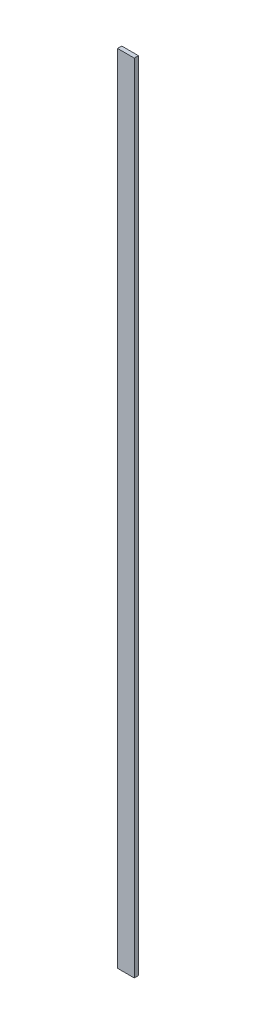
ISO-10303-21;
HEADER;
FILE_DESCRIPTION(('STEP AP214'),'2;1');
FILE_NAME('part.step','',(''),(''),'','','');
FILE_SCHEMA(('AUTOMOTIVE_DESIGN { 1 0 10303 214 1 1 1 1 }'));
ENDSEC;
DATA;
#1=APPLICATION_CONTEXT('core data for automotive mechanical design processes');
#2=APPLICATION_PROTOCOL_DEFINITION('international standard','automotive_design',2000,#1);
#3=PRODUCT_CONTEXT('',#1,'mechanical');
#4=PRODUCT('Part','Part','',(#3));
#5=PRODUCT_RELATED_PRODUCT_CATEGORY('part','',(#4));
#6=PRODUCT_DEFINITION_FORMATION('','',#4);
#7=PRODUCT_DEFINITION_CONTEXT('part definition',#1,'design');
#8=PRODUCT_DEFINITION('design','',#6,#7);
#9=PRODUCT_DEFINITION_SHAPE('','',#8);
#10=(LENGTH_UNIT() NAMED_UNIT(*) SI_UNIT(.MILLI.,.METRE.));
#11=(NAMED_UNIT(*) PLANE_ANGLE_UNIT() SI_UNIT($,.RADIAN.));
#12=(NAMED_UNIT(*) SI_UNIT($,.STERADIAN.) SOLID_ANGLE_UNIT());
#13=UNCERTAINTY_MEASURE_WITH_UNIT(LENGTH_MEASURE(1.E-05),#10,'distance_accuracy_value','');
#14=(GEOMETRIC_REPRESENTATION_CONTEXT(3) GLOBAL_UNCERTAINTY_ASSIGNED_CONTEXT((#13)) GLOBAL_UNIT_ASSIGNED_CONTEXT((#10,
#11,#12)) REPRESENTATION_CONTEXT('',''));
#15=CARTESIAN_POINT('',(0.,0.,0.));
#16=DIRECTION('',(0.,0.,1.));
#17=DIRECTION('',(1.,0.,0.));
#18=AXIS2_PLACEMENT_3D('',#15,#16,#17);
#19=CARTESIAN_POINT('',(-7.61927440677514,-72.5659605290053,1.5875));
#20=DIRECTION('',(-0.999999999996431,-2.67172428952427E-06,0.));
#21=DIRECTION('',(2.67172428952427E-06,-0.999999999996431,0.));
#22=AXIS2_PLACEMENT_3D('',#19,#20,#21);
#23=PLANE('',#22);
#24=DIRECTION('',(-2.67172428952427E-06,0.999999999996431,0.));
#25=VECTOR('',#24,1.);
#26=CARTESIAN_POINT('',(-7.61927440677514,-72.5659605290053,0.));
#27=LINE('',#26,#25);
#28=CARTESIAN_POINT('',(-7.61927440677514,-72.5659605290053,0.));
#29=VERTEX_POINT('',#28);
#30=CARTESIAN_POINT('',(-7.62008197393296,229.698446389669,0.));
#31=VERTEX_POINT('',#30);
#32=EDGE_CURVE('E95',#29,#31,#27,.T.);
#33=ORIENTED_EDGE('',*,*,#32,.T.);
#34=DIRECTION('',(0.,0.,-1.));
#35=VECTOR('',#34,1.);
#36=CARTESIAN_POINT('',(-7.62008197393296,229.698446389669,1.5875));
#37=LINE('',#36,#35);
#38=CARTESIAN_POINT('',(-7.62008197393296,229.698446389669,1.5875));
#39=VERTEX_POINT('',#38);
#40=EDGE_CURVE('E11',#39,#31,#37,.T.);
#41=ORIENTED_EDGE('',*,*,#40,.F.);
#42=DIRECTION('',(-2.67172428952427E-06,0.999999999996431,0.));
#43=VECTOR('',#42,1.);
#44=CARTESIAN_POINT('',(-7.61927440677514,-72.5659605290053,1.5875));
#45=LINE('',#44,#43);
#46=CARTESIAN_POINT('',(-7.61927440677514,-72.5659605290053,1.5875));
#47=VERTEX_POINT('',#46);
#48=EDGE_CURVE('E83',#47,#39,#45,.T.);
#49=ORIENTED_EDGE('',*,*,#48,.F.);
#50=DIRECTION('',(0.,0.,-1.));
#51=VECTOR('',#50,1.);
#52=CARTESIAN_POINT('',(-7.61927440677514,-72.5659605290053,1.5875));
#53=LINE('',#52,#51);
#54=EDGE_CURVE('E91',#47,#29,#53,.T.);
#55=ORIENTED_EDGE('',*,*,#54,.T.);
#56=EDGE_LOOP('',(#33,#41,#49,#55));
#57=FACE_BOUND('',#56,.T.);
#58=ADVANCED_FACE('F32',(#57),#23,.F.);
#59=CARTESIAN_POINT('',(-7.62008197393296,229.698446389669,1.5875));
#60=DIRECTION('',(0.,-1.,0.));
#61=DIRECTION('',(0.,0.,-1.));
#62=AXIS2_PLACEMENT_3D('',#59,#60,#61);
#63=PLANE('',#62);
#64=DIRECTION('',(-1.,0.,0.));
#65=VECTOR('',#64,1.);
#66=CARTESIAN_POINT('',(-7.62008197393296,229.698446389669,0.));
#67=LINE('',#66,#65);
#68=CARTESIAN_POINT('',(-13.970081973933,229.698446389669,0.));
#69=VERTEX_POINT('',#68);
#70=EDGE_CURVE('E87',#31,#69,#67,.T.);
#71=ORIENTED_EDGE('',*,*,#70,.T.);
#72=DIRECTION('',(0.,0.,-1.));
#73=VECTOR('',#72,1.);
#74=CARTESIAN_POINT('',(-13.970081973933,229.698446389669,1.5875));
#75=LINE('',#74,#73);
#76=CARTESIAN_POINT('',(-13.970081973933,229.698446389669,1.5875));
#77=VERTEX_POINT('',#76);
#78=EDGE_CURVE('E40',#77,#69,#75,.T.);
#79=ORIENTED_EDGE('',*,*,#78,.F.);
#80=DIRECTION('',(-1.,0.,0.));
#81=VECTOR('',#80,1.);
#82=CARTESIAN_POINT('',(-7.62008197393296,229.698446389669,1.5875));
#83=LINE('',#82,#81);
#84=EDGE_CURVE('E78',#39,#77,#83,.T.);
#85=ORIENTED_EDGE('',*,*,#84,.F.);
#86=ORIENTED_EDGE('',*,*,#40,.T.);
#87=EDGE_LOOP('',(#71,#79,#85,#86));
#88=FACE_BOUND('',#87,.T.);
#89=ADVANCED_FACE('F86',(#88),#63,.F.);
#90=CARTESIAN_POINT('',(-13.970081973933,229.698446389669,1.5875));
#91=DIRECTION('',(0.999999999996431,2.67172428953575E-06,0.));
#92=DIRECTION('',(-2.67172428953575E-06,0.999999999996431,0.));
#93=AXIS2_PLACEMENT_3D('',#90,#91,#92);
#94=PLANE('',#93);
#95=DIRECTION('',(2.67172428953575E-06,-0.999999999996431,0.));
#96=VECTOR('',#95,1.);
#97=CARTESIAN_POINT('',(-13.970081973933,229.698446389669,0.));
#98=LINE('',#97,#96);
#99=CARTESIAN_POINT('',(-13.9692744067751,-72.5659605290053,0.));
#100=VERTEX_POINT('',#99);
#101=EDGE_CURVE('E65',#69,#100,#98,.T.);
#102=ORIENTED_EDGE('',*,*,#101,.T.);
#103=DIRECTION('',(0.,0.,-1.));
#104=VECTOR('',#103,1.);
#105=CARTESIAN_POINT('',(-13.9692744067751,-72.5659605290053,1.5875));
#106=LINE('',#105,#104);
#107=CARTESIAN_POINT('',(-13.9692744067751,-72.5659605290053,1.5875));
#108=VERTEX_POINT('',#107);
#109=EDGE_CURVE('E88',#108,#100,#106,.T.);
#110=ORIENTED_EDGE('',*,*,#109,.F.);
#111=DIRECTION('',(2.67172428953575E-06,-0.999999999996431,0.));
#112=VECTOR('',#111,1.);
#113=CARTESIAN_POINT('',(-13.970081973933,229.698446389669,1.5875));
#114=LINE('',#113,#112);
#115=EDGE_CURVE('E81',#77,#108,#114,.T.);
#116=ORIENTED_EDGE('',*,*,#115,.F.);
#117=ORIENTED_EDGE('',*,*,#78,.T.);
#118=EDGE_LOOP('',(#102,#110,#116,#117));
#119=FACE_BOUND('',#118,.T.);
#120=ADVANCED_FACE('F89',(#119),#94,.F.);
#121=CARTESIAN_POINT('',(-7.61927440677514,-72.5659605290053,1.5875));
#122=DIRECTION('',(0.,1.,0.));
#123=DIRECTION('',(0.,0.,1.));
#124=AXIS2_PLACEMENT_3D('',#121,#122,#123);
#125=PLANE('',#124);
#126=DIRECTION('',(1.,0.,0.));
#127=VECTOR('',#126,1.);
#128=CARTESIAN_POINT('',(-7.61927440677514,-72.5659605290053,0.));
#129=LINE('',#128,#127);
#130=EDGE_CURVE('E71',#100,#29,#129,.T.);
#131=ORIENTED_EDGE('',*,*,#130,.T.);
#132=ORIENTED_EDGE('',*,*,#54,.F.);
#133=DIRECTION('',(1.,0.,0.));
#134=VECTOR('',#133,1.);
#135=CARTESIAN_POINT('',(-7.61927440677514,-72.5659605290053,1.5875));
#136=LINE('',#135,#134);
#137=EDGE_CURVE('E48',#108,#47,#136,.T.);
#138=ORIENTED_EDGE('',*,*,#137,.F.);
#139=ORIENTED_EDGE('',*,*,#109,.T.);
#140=EDGE_LOOP('',(#131,#132,#138,#139));
#141=FACE_BOUND('',#140,.T.);
#142=ADVANCED_FACE('F102',(#141),#125,.F.);
#143=CARTESIAN_POINT('',(0.,0.,1.5875));
#144=DIRECTION('',(0.,0.,1.));
#145=DIRECTION('',(1.,0.,0.));
#146=AXIS2_PLACEMENT_3D('',#143,#144,#145);
#147=PLANE('',#146);
#148=ORIENTED_EDGE('',*,*,#48,.T.);
#149=ORIENTED_EDGE('',*,*,#84,.T.);
#150=ORIENTED_EDGE('',*,*,#115,.T.);
#151=ORIENTED_EDGE('',*,*,#137,.T.);
#152=EDGE_LOOP('',(#148,#149,#150,#151));
#153=FACE_BOUND('',#152,.T.);
#154=ADVANCED_FACE('F79',(#153),#147,.T.);
#155=CARTESIAN_POINT('',(0.,0.,0.));
#156=DIRECTION('',(0.,0.,1.));
#157=DIRECTION('',(1.,0.,0.));
#158=AXIS2_PLACEMENT_3D('',#155,#156,#157);
#159=PLANE('',#158);
#160=ORIENTED_EDGE('',*,*,#32,.F.);
#161=ORIENTED_EDGE('',*,*,#130,.F.);
#162=ORIENTED_EDGE('',*,*,#101,.F.);
#163=ORIENTED_EDGE('',*,*,#70,.F.);
#164=EDGE_LOOP('',(#160,#161,#162,#163));
#165=FACE_BOUND('',#164,.T.);
#166=ADVANCED_FACE('F105',(#165),#159,.F.);
#167=CLOSED_SHELL('',(#58,#89,#120,#142,#154,#166));
#168=MANIFOLD_SOLID_BREP('B2',#167);
#169=ADVANCED_BREP_SHAPE_REPRESENTATION('',(#18,#168),#14);
#170=SHAPE_DEFINITION_REPRESENTATION(#9,#169);
ENDSEC;
END-ISO-10303-21;
